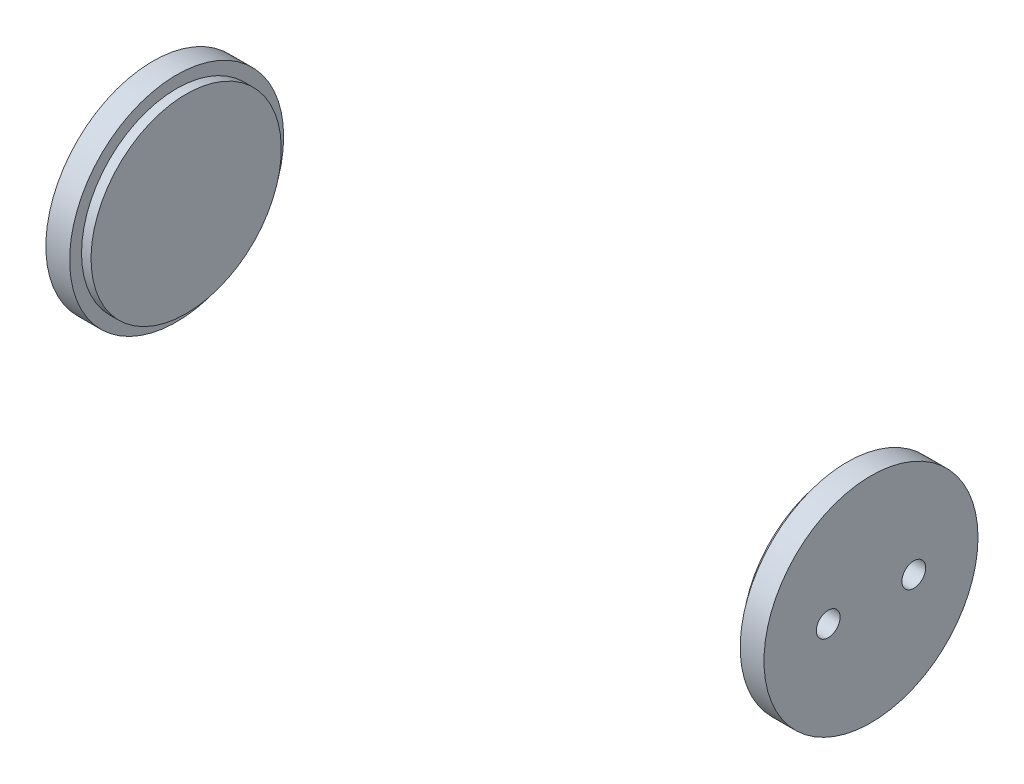
ISO-10303-21;
HEADER;
FILE_DESCRIPTION(('STEP AP214'),'2;1');
FILE_NAME('part.step','',(''),(''),'','','');
FILE_SCHEMA(('AUTOMOTIVE_DESIGN { 1 0 10303 214 1 1 1 1 }'));
ENDSEC;
DATA;
#1=APPLICATION_CONTEXT('core data for automotive mechanical design processes');
#2=APPLICATION_PROTOCOL_DEFINITION('international standard','automotive_design',2000,#1);
#3=PRODUCT_CONTEXT('',#1,'mechanical');
#4=PRODUCT('Part','Part','',(#3));
#5=PRODUCT_RELATED_PRODUCT_CATEGORY('part','',(#4));
#6=PRODUCT_DEFINITION_FORMATION('','',#4);
#7=PRODUCT_DEFINITION_CONTEXT('part definition',#1,'design');
#8=PRODUCT_DEFINITION('design','',#6,#7);
#9=PRODUCT_DEFINITION_SHAPE('','',#8);
#10=(LENGTH_UNIT() NAMED_UNIT(*) SI_UNIT(.MILLI.,.METRE.));
#11=(NAMED_UNIT(*) PLANE_ANGLE_UNIT() SI_UNIT($,.RADIAN.));
#12=(NAMED_UNIT(*) SI_UNIT($,.STERADIAN.) SOLID_ANGLE_UNIT());
#13=UNCERTAINTY_MEASURE_WITH_UNIT(LENGTH_MEASURE(1.E-05),#10,'distance_accuracy_value','');
#14=(GEOMETRIC_REPRESENTATION_CONTEXT(3) GLOBAL_UNCERTAINTY_ASSIGNED_CONTEXT((#13)) GLOBAL_UNIT_ASSIGNED_CONTEXT((#10,
#11,#12)) REPRESENTATION_CONTEXT('',''));
#15=CARTESIAN_POINT('',(0.,0.,0.));
#16=DIRECTION('',(0.,0.,1.));
#17=DIRECTION('',(1.,0.,0.));
#18=AXIS2_PLACEMENT_3D('',#15,#16,#17);
#19=CARTESIAN_POINT('',(2.5,0.,0.));
#20=DIRECTION('',(-1.,0.,0.));
#21=DIRECTION('',(0.,0.,1.));
#22=AXIS2_PLACEMENT_3D('',#19,#20,#21);
#23=CYLINDRICAL_SURFACE('',#22,22.5);
#24=CARTESIAN_POINT('',(2.5,0.,0.));
#25=DIRECTION('',(1.,0.,0.));
#26=DIRECTION('',(0.,0.,-1.));
#27=AXIS2_PLACEMENT_3D('',#24,#25,#26);
#28=CIRCLE('',#27,22.5);
#29=CARTESIAN_POINT('',(2.5,0.,-22.5));
#30=VERTEX_POINT('',#29);
#31=EDGE_CURVE('E72',#30,#30,#28,.T.);
#32=ORIENTED_EDGE('',*,*,#31,.F.);
#33=EDGE_LOOP('',(#32));
#34=FACE_BOUND('',#33,.T.);
#35=CARTESIAN_POINT('',(-2.5,0.,0.));
#36=DIRECTION('',(1.,0.,0.));
#37=DIRECTION('',(0.,0.,-1.));
#38=AXIS2_PLACEMENT_3D('',#35,#36,#37);
#39=CIRCLE('',#38,22.5);
#40=CARTESIAN_POINT('',(-2.5,0.,-22.5));
#41=VERTEX_POINT('',#40);
#42=EDGE_CURVE('E75',#41,#41,#39,.T.);
#43=ORIENTED_EDGE('',*,*,#42,.T.);
#44=EDGE_LOOP('',(#43));
#45=FACE_BOUND('',#44,.T.);
#46=ADVANCED_FACE('F49',(#34,#45),#23,.T.);
#47=CARTESIAN_POINT('',(2.5,0.,0.));
#48=DIRECTION('',(1.,0.,0.));
#49=DIRECTION('',(0.,0.,-1.));
#50=AXIS2_PLACEMENT_3D('',#47,#48,#49);
#51=PLANE('',#50);
#52=CARTESIAN_POINT('',(2.5,0.,0.));
#53=DIRECTION('',(1.,0.,0.));
#54=DIRECTION('',(0.,0.,-1.));
#55=AXIS2_PLACEMENT_3D('',#52,#53,#54);
#56=CIRCLE('',#55,20.);
#57=CARTESIAN_POINT('',(2.5,0.,-20.));
#58=VERTEX_POINT('',#57);
#59=EDGE_CURVE('E67',#58,#58,#56,.T.);
#60=ORIENTED_EDGE('',*,*,#59,.F.);
#61=EDGE_LOOP('',(#60));
#62=FACE_BOUND('',#61,.T.);
#63=ORIENTED_EDGE('',*,*,#31,.T.);
#64=EDGE_LOOP('',(#63));
#65=FACE_BOUND('',#64,.T.);
#66=ADVANCED_FACE('F83',(#62,#65),#51,.T.);
#67=CARTESIAN_POINT('',(-2.5,0.,0.));
#68=DIRECTION('',(1.,0.,0.));
#69=DIRECTION('',(0.,0.,-1.));
#70=AXIS2_PLACEMENT_3D('',#67,#68,#69);
#71=PLANE('',#70);
#72=CARTESIAN_POINT('',(-2.5,0.,-9.));
#73=DIRECTION('',(-1.,0.,0.));
#74=DIRECTION('',(0.,0.,1.));
#75=AXIS2_PLACEMENT_3D('',#72,#73,#74);
#76=CIRCLE('',#75,2.5);
#77=CARTESIAN_POINT('',(-2.5,0.,-6.5));
#78=VERTEX_POINT('',#77);
#79=EDGE_CURVE('E57',#78,#78,#76,.T.);
#80=ORIENTED_EDGE('',*,*,#79,.F.);
#81=EDGE_LOOP('',(#80));
#82=FACE_BOUND('',#81,.T.);
#83=CARTESIAN_POINT('',(-2.5,0.,9.));
#84=DIRECTION('',(-1.,0.,0.));
#85=DIRECTION('',(0.,0.,1.));
#86=AXIS2_PLACEMENT_3D('',#83,#84,#85);
#87=CIRCLE('',#86,2.5);
#88=CARTESIAN_POINT('',(-2.5,0.,11.5));
#89=VERTEX_POINT('',#88);
#90=EDGE_CURVE('E64',#89,#89,#87,.T.);
#91=ORIENTED_EDGE('',*,*,#90,.F.);
#92=EDGE_LOOP('',(#91));
#93=FACE_BOUND('',#92,.T.);
#94=ORIENTED_EDGE('',*,*,#42,.F.);
#95=EDGE_LOOP('',(#94));
#96=FACE_BOUND('',#95,.T.);
#97=ADVANCED_FACE('F80',(#82,#93,#96),#71,.F.);
#98=CARTESIAN_POINT('',(4.5,0.,0.));
#99=DIRECTION('',(-1.,0.,0.));
#100=DIRECTION('',(0.,0.,1.));
#101=AXIS2_PLACEMENT_3D('',#98,#99,#100);
#102=CYLINDRICAL_SURFACE('',#101,20.);
#103=CARTESIAN_POINT('',(4.50000000000001,0.,0.));
#104=DIRECTION('',(-1.,0.,0.));
#105=DIRECTION('',(0.,-1.,0.));
#106=AXIS2_PLACEMENT_3D('',#103,#104,#105);
#107=CIRCLE('',#106,20.);
#108=CARTESIAN_POINT('',(4.50000000000001,-20.,0.));
#109=VERTEX_POINT('',#108);
#110=EDGE_CURVE('E53',#109,#109,#107,.T.);
#111=ORIENTED_EDGE('',*,*,#110,.T.);
#112=EDGE_LOOP('',(#111));
#113=FACE_BOUND('',#112,.T.);
#114=ORIENTED_EDGE('',*,*,#59,.T.);
#115=EDGE_LOOP('',(#114));
#116=FACE_BOUND('',#115,.T.);
#117=ADVANCED_FACE('F82',(#113,#116),#102,.T.);
#118=CARTESIAN_POINT('',(2.5,0.,9.));
#119=DIRECTION('',(-1.,0.,0.));
#120=DIRECTION('',(0.,0.,1.));
#121=AXIS2_PLACEMENT_3D('',#118,#119,#120);
#122=CYLINDRICAL_SURFACE('',#121,2.5);
#123=CARTESIAN_POINT('',(2.5,0.,9.));
#124=DIRECTION('',(-1.,0.,0.));
#125=DIRECTION('',(0.,0.,1.));
#126=AXIS2_PLACEMENT_3D('',#123,#124,#125);
#127=CIRCLE('',#126,2.5);
#128=CARTESIAN_POINT('',(2.5,0.,11.5));
#129=VERTEX_POINT('',#128);
#130=EDGE_CURVE('E61',#129,#129,#127,.T.);
#131=ORIENTED_EDGE('',*,*,#130,.F.);
#132=EDGE_LOOP('',(#131));
#133=FACE_BOUND('',#132,.T.);
#134=ORIENTED_EDGE('',*,*,#90,.T.);
#135=EDGE_LOOP('',(#134));
#136=FACE_BOUND('',#135,.T.);
#137=ADVANCED_FACE('F90',(#133,#136),#122,.F.);
#138=CARTESIAN_POINT('',(2.5,0.,9.));
#139=DIRECTION('',(-1.,0.,0.));
#140=DIRECTION('',(0.,0.,1.));
#141=AXIS2_PLACEMENT_3D('',#138,#139,#140);
#142=PLANE('',#141);
#143=ORIENTED_EDGE('',*,*,#130,.T.);
#144=EDGE_LOOP('',(#143));
#145=FACE_BOUND('',#144,.T.);
#146=ADVANCED_FACE('F146',(#145),#142,.T.);
#147=CARTESIAN_POINT('',(2.5,0.,-9.));
#148=DIRECTION('',(-1.,0.,0.));
#149=DIRECTION('',(0.,0.,1.));
#150=AXIS2_PLACEMENT_3D('',#147,#148,#149);
#151=CYLINDRICAL_SURFACE('',#150,2.5);
#152=CARTESIAN_POINT('',(2.5,0.,-9.));
#153=DIRECTION('',(-1.,0.,0.));
#154=DIRECTION('',(0.,0.,1.));
#155=AXIS2_PLACEMENT_3D('',#152,#153,#154);
#156=CIRCLE('',#155,2.5);
#157=CARTESIAN_POINT('',(2.5,0.,-6.5));
#158=VERTEX_POINT('',#157);
#159=EDGE_CURVE('E11',#158,#158,#156,.T.);
#160=ORIENTED_EDGE('',*,*,#159,.F.);
#161=EDGE_LOOP('',(#160));
#162=FACE_BOUND('',#161,.T.);
#163=ORIENTED_EDGE('',*,*,#79,.T.);
#164=EDGE_LOOP('',(#163));
#165=FACE_BOUND('',#164,.T.);
#166=ADVANCED_FACE('F139',(#162,#165),#151,.F.);
#167=CARTESIAN_POINT('',(2.5,0.,-9.));
#168=DIRECTION('',(-1.,0.,0.));
#169=DIRECTION('',(0.,0.,1.));
#170=AXIS2_PLACEMENT_3D('',#167,#168,#169);
#171=PLANE('',#170);
#172=ORIENTED_EDGE('',*,*,#159,.T.);
#173=EDGE_LOOP('',(#172));
#174=FACE_BOUND('',#173,.T.);
#175=ADVANCED_FACE('F127',(#174),#171,.T.);
#176=CARTESIAN_POINT('',(4.5,22.5,-32.));
#177=DIRECTION('',(-1.,0.,0.));
#178=DIRECTION('',(0.,-1.,0.));
#179=AXIS2_PLACEMENT_3D('',#176,#177,#178);
#180=PLANE('',#179);
#181=ORIENTED_EDGE('',*,*,#110,.F.);
#182=EDGE_LOOP('',(#181));
#183=FACE_BOUND('',#182,.T.);
#184=ADVANCED_FACE('F51',(#183),#180,.F.);
#185=CLOSED_SHELL('',(#46,#66,#97,#117,#137,#146,#166,#175,#184));
#186=MANIFOLD_SOLID_BREP('B2',#185);
#187=CARTESIAN_POINT('',(143.5,0.,0.));
#188=DIRECTION('',(1.,0.,0.));
#189=DIRECTION('',(0.,0.,-1.));
#190=AXIS2_PLACEMENT_3D('',#187,#188,#189);
#191=PLANE('',#190);
#192=CARTESIAN_POINT('',(143.5,0.,-9.));
#193=DIRECTION('',(1.,0.,0.));
#194=DIRECTION('',(0.,0.,-1.));
#195=AXIS2_PLACEMENT_3D('',#192,#193,#194);
#196=CIRCLE('',#195,2.5);
#197=CARTESIAN_POINT('',(143.5,0.,-11.5));
#198=VERTEX_POINT('',#197);
#199=EDGE_CURVE('E216',#198,#198,#196,.F.);
#200=ORIENTED_EDGE('',*,*,#199,.F.);
#201=EDGE_LOOP('',(#200));
#202=FACE_BOUND('',#201,.T.);
#203=ADVANCED_FACE('F200',(#202),#191,.T.);
#204=CARTESIAN_POINT('',(143.5,0.,0.));
#205=DIRECTION('',(1.,0.,0.));
#206=DIRECTION('',(0.,0.,-1.));
#207=AXIS2_PLACEMENT_3D('',#204,#205,#206);
#208=PLANE('',#207);
#209=CARTESIAN_POINT('',(143.5,0.,9.));
#210=DIRECTION('',(1.,0.,0.));
#211=DIRECTION('',(0.,0.,-1.));
#212=AXIS2_PLACEMENT_3D('',#209,#210,#211);
#213=CIRCLE('',#212,2.5);
#214=CARTESIAN_POINT('',(143.5,0.,6.5));
#215=VERTEX_POINT('',#214);
#216=EDGE_CURVE('E221',#215,#215,#213,.T.);
#217=ORIENTED_EDGE('',*,*,#216,.T.);
#218=EDGE_LOOP('',(#217));
#219=FACE_BOUND('',#218,.T.);
#220=ADVANCED_FACE('F244',(#219),#208,.T.);
#221=CARTESIAN_POINT('',(143.5,0.,-9.));
#222=DIRECTION('',(1.,0.,0.));
#223=DIRECTION('',(0.,0.,-1.));
#224=AXIS2_PLACEMENT_3D('',#221,#222,#223);
#225=CYLINDRICAL_SURFACE('',#224,2.5);
#226=ORIENTED_EDGE('',*,*,#199,.T.);
#227=EDGE_LOOP('',(#226));
#228=FACE_BOUND('',#227,.T.);
#229=CARTESIAN_POINT('',(148.5,0.,-9.));
#230=DIRECTION('',(1.,0.,0.));
#231=DIRECTION('',(0.,0.,-1.));
#232=AXIS2_PLACEMENT_3D('',#229,#230,#231);
#233=CIRCLE('',#232,2.5);
#234=CARTESIAN_POINT('',(148.5,0.,-11.5));
#235=VERTEX_POINT('',#234);
#236=EDGE_CURVE('E225',#235,#235,#233,.F.);
#237=ORIENTED_EDGE('',*,*,#236,.F.);
#238=EDGE_LOOP('',(#237));
#239=FACE_BOUND('',#238,.T.);
#240=ADVANCED_FACE('F251',(#228,#239),#225,.F.);
#241=CARTESIAN_POINT('',(143.5,0.,9.));
#242=DIRECTION('',(1.,0.,0.));
#243=DIRECTION('',(0.,0.,-1.));
#244=AXIS2_PLACEMENT_3D('',#241,#242,#243);
#245=CYLINDRICAL_SURFACE('',#244,2.5);
#246=ORIENTED_EDGE('',*,*,#216,.F.);
#247=EDGE_LOOP('',(#246));
#248=FACE_BOUND('',#247,.T.);
#249=CARTESIAN_POINT('',(148.5,0.,9.));
#250=DIRECTION('',(1.,0.,0.));
#251=DIRECTION('',(0.,0.,-1.));
#252=AXIS2_PLACEMENT_3D('',#249,#250,#251);
#253=CIRCLE('',#252,2.5);
#254=CARTESIAN_POINT('',(148.5,0.,6.5));
#255=VERTEX_POINT('',#254);
#256=EDGE_CURVE('E218',#255,#255,#253,.T.);
#257=ORIENTED_EDGE('',*,*,#256,.T.);
#258=EDGE_LOOP('',(#257));
#259=FACE_BOUND('',#258,.T.);
#260=ADVANCED_FACE('F256',(#248,#259),#245,.F.);
#261=CARTESIAN_POINT('',(148.5,0.,0.));
#262=DIRECTION('',(1.,0.,0.));
#263=DIRECTION('',(0.,0.,-1.));
#264=AXIS2_PLACEMENT_3D('',#261,#262,#263);
#265=PLANE('',#264);
#266=CARTESIAN_POINT('',(148.5,0.,0.));
#267=DIRECTION('',(1.,0.,0.));
#268=DIRECTION('',(0.,0.,-1.));
#269=AXIS2_PLACEMENT_3D('',#266,#267,#268);
#270=CIRCLE('',#269,22.5);
#271=CARTESIAN_POINT('',(148.5,0.,-22.5));
#272=VERTEX_POINT('',#271);
#273=EDGE_CURVE('E207',#272,#272,#270,.T.);
#274=ORIENTED_EDGE('',*,*,#273,.T.);
#275=EDGE_LOOP('',(#274));
#276=FACE_BOUND('',#275,.T.);
#277=ORIENTED_EDGE('',*,*,#256,.F.);
#278=EDGE_LOOP('',(#277));
#279=FACE_BOUND('',#278,.T.);
#280=ORIENTED_EDGE('',*,*,#236,.T.);
#281=EDGE_LOOP('',(#280));
#282=FACE_BOUND('',#281,.T.);
#283=ADVANCED_FACE('F261',(#276,#279,#282),#265,.T.);
#284=CARTESIAN_POINT('',(148.5,0.,0.));
#285=DIRECTION('',(-1.,0.,0.));
#286=DIRECTION('',(0.,0.,1.));
#287=AXIS2_PLACEMENT_3D('',#284,#285,#286);
#288=CYLINDRICAL_SURFACE('',#287,22.5);
#289=ORIENTED_EDGE('',*,*,#273,.F.);
#290=EDGE_LOOP('',(#289));
#291=FACE_BOUND('',#290,.T.);
#292=CARTESIAN_POINT('',(143.5,0.,0.));
#293=DIRECTION('',(1.,0.,0.));
#294=DIRECTION('',(0.,0.,-1.));
#295=AXIS2_PLACEMENT_3D('',#292,#293,#294);
#296=CIRCLE('',#295,22.5);
#297=CARTESIAN_POINT('',(143.5,0.,-22.5));
#298=VERTEX_POINT('',#297);
#299=EDGE_CURVE('E211',#298,#298,#296,.T.);
#300=ORIENTED_EDGE('',*,*,#299,.T.);
#301=EDGE_LOOP('',(#300));
#302=FACE_BOUND('',#301,.T.);
#303=ADVANCED_FACE('F265',(#291,#302),#288,.T.);
#304=CARTESIAN_POINT('',(143.5,0.,0.));
#305=DIRECTION('',(1.,0.,0.));
#306=DIRECTION('',(0.,0.,-1.));
#307=AXIS2_PLACEMENT_3D('',#304,#305,#306);
#308=PLANE('',#307);
#309=CARTESIAN_POINT('',(143.5,0.,0.));
#310=DIRECTION('',(1.,0.,0.));
#311=DIRECTION('',(0.,0.,-1.));
#312=AXIS2_PLACEMENT_3D('',#309,#310,#311);
#313=CIRCLE('',#312,20.);
#314=CARTESIAN_POINT('',(143.5,0.,-20.));
#315=VERTEX_POINT('',#314);
#316=EDGE_CURVE('E48',#315,#315,#313,.T.);
#317=ORIENTED_EDGE('',*,*,#316,.T.);
#318=EDGE_LOOP('',(#317));
#319=FACE_BOUND('',#318,.T.);
#320=ORIENTED_EDGE('',*,*,#299,.F.);
#321=EDGE_LOOP('',(#320));
#322=FACE_BOUND('',#321,.T.);
#323=ADVANCED_FACE('F240',(#319,#322),#308,.F.);
#324=CARTESIAN_POINT('',(143.5,0.,0.));
#325=DIRECTION('',(-1.,0.,0.));
#326=DIRECTION('',(0.,0.,1.));
#327=AXIS2_PLACEMENT_3D('',#324,#325,#326);
#328=CYLINDRICAL_SURFACE('',#327,20.);
#329=ORIENTED_EDGE('',*,*,#316,.F.);
#330=EDGE_LOOP('',(#329));
#331=FACE_BOUND('',#330,.T.);
#332=CARTESIAN_POINT('',(141.5,0.,0.));
#333=DIRECTION('',(1.,0.,0.));
#334=DIRECTION('',(0.,0.,-1.));
#335=AXIS2_PLACEMENT_3D('',#332,#333,#334);
#336=CIRCLE('',#335,20.);
#337=CARTESIAN_POINT('',(141.5,0.,-20.));
#338=VERTEX_POINT('',#337);
#339=EDGE_CURVE('E222',#338,#338,#336,.T.);
#340=ORIENTED_EDGE('',*,*,#339,.T.);
#341=EDGE_LOOP('',(#340));
#342=FACE_BOUND('',#341,.T.);
#343=ADVANCED_FACE('F202',(#331,#342),#328,.T.);
#344=CARTESIAN_POINT('',(141.5,22.5,-32.));
#345=DIRECTION('',(1.,0.,0.));
#346=DIRECTION('',(0.,0.,-1.));
#347=AXIS2_PLACEMENT_3D('',#344,#345,#346);
#348=PLANE('',#347);
#349=ORIENTED_EDGE('',*,*,#339,.F.);
#350=EDGE_LOOP('',(#349));
#351=FACE_BOUND('',#350,.T.);
#352=ADVANCED_FACE('F234',(#351),#348,.F.);
#353=CLOSED_SHELL('',(#203,#220,#240,#260,#283,#303,#323,#343,#352));
#354=MANIFOLD_SOLID_BREP('B6',#353);
#355=ADVANCED_BREP_SHAPE_REPRESENTATION('',(#18,#186,#354),#14);
#356=SHAPE_DEFINITION_REPRESENTATION(#9,#355);
ENDSEC;
END-ISO-10303-21;
